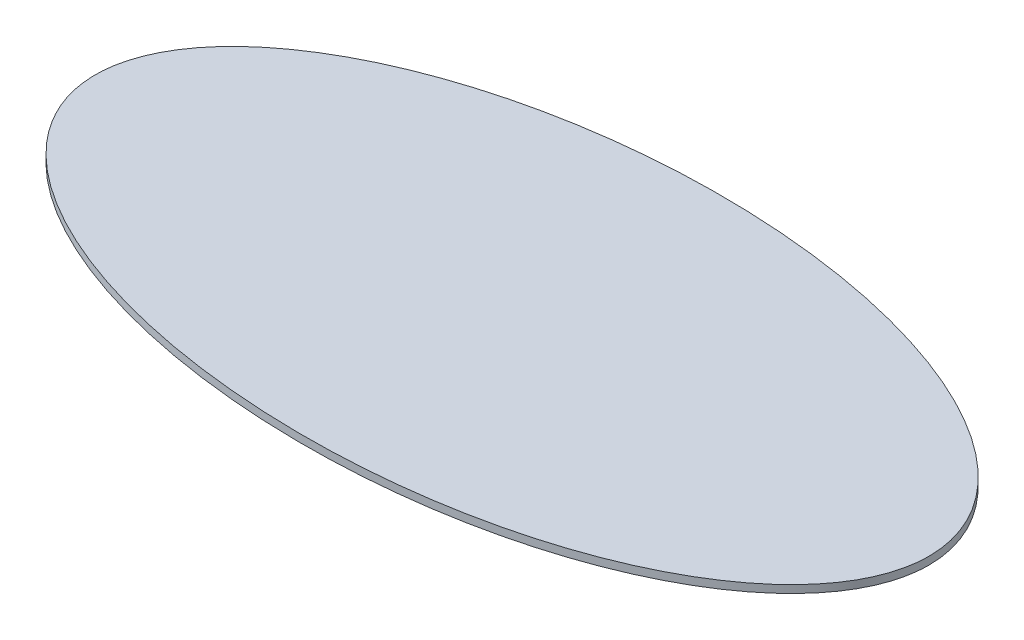
ISO-10303-21;
HEADER;
FILE_DESCRIPTION(('STEP AP214'),'2;1');
FILE_NAME('part.step','',(''),(''),'','','');
FILE_SCHEMA(('AUTOMOTIVE_DESIGN { 1 0 10303 214 1 1 1 1 }'));
ENDSEC;
DATA;
#1=APPLICATION_CONTEXT('core data for automotive mechanical design processes');
#2=APPLICATION_PROTOCOL_DEFINITION('international standard','automotive_design',2000,#1);
#3=PRODUCT_CONTEXT('',#1,'mechanical');
#4=PRODUCT('Part','Part','',(#3));
#5=PRODUCT_RELATED_PRODUCT_CATEGORY('part','',(#4));
#6=PRODUCT_DEFINITION_FORMATION('','',#4);
#7=PRODUCT_DEFINITION_CONTEXT('part definition',#1,'design');
#8=PRODUCT_DEFINITION('design','',#6,#7);
#9=PRODUCT_DEFINITION_SHAPE('','',#8);
#10=(LENGTH_UNIT() NAMED_UNIT(*) SI_UNIT(.MILLI.,.METRE.));
#11=(NAMED_UNIT(*) PLANE_ANGLE_UNIT() SI_UNIT($,.RADIAN.));
#12=(NAMED_UNIT(*) SI_UNIT($,.STERADIAN.) SOLID_ANGLE_UNIT());
#13=UNCERTAINTY_MEASURE_WITH_UNIT(LENGTH_MEASURE(1.E-05),#10,'distance_accuracy_value','');
#14=(GEOMETRIC_REPRESENTATION_CONTEXT(3) GLOBAL_UNCERTAINTY_ASSIGNED_CONTEXT((#13)) GLOBAL_UNIT_ASSIGNED_CONTEXT((#10,
#11,#12)) REPRESENTATION_CONTEXT('',''));
#15=CARTESIAN_POINT('',(0.,0.,0.));
#16=DIRECTION('',(0.,0.,1.));
#17=DIRECTION('',(1.,0.,0.));
#18=AXIS2_PLACEMENT_3D('',#15,#16,#17);
#19=CARTESIAN_POINT('',(0.,1.,0.));
#20=DIRECTION('',(0.,1.,0.));
#21=DIRECTION('',(1.,0.,0.));
#22=AXIS2_PLACEMENT_3D('',#19,#20,#21);
#23=ELLIPSE('',#22,54.,27.);
#24=DIRECTION('',(0.,-1.,0.));
#25=VECTOR('',#24,1.);
#26=SURFACE_OF_LINEAR_EXTRUSION('',#23,#25);
#27=CARTESIAN_POINT('',(54.,1.,0.));
#28=VERTEX_POINT('',#27);
#29=EDGE_CURVE('E10',#28,#28,#23,.T.);
#30=ORIENTED_EDGE('',*,*,#29,.F.);
#31=EDGE_LOOP('',(#30));
#32=FACE_BOUND('',#31,.T.);
#33=CARTESIAN_POINT('',(0.,0.,0.));
#34=DIRECTION('',(0.,1.,0.));
#35=DIRECTION('',(1.,0.,0.));
#36=AXIS2_PLACEMENT_3D('',#33,#34,#35);
#37=ELLIPSE('',#36,54.,27.);
#38=CARTESIAN_POINT('',(54.,0.,0.));
#39=VERTEX_POINT('',#38);
#40=EDGE_CURVE('E38',#39,#39,#37,.T.);
#41=ORIENTED_EDGE('',*,*,#40,.T.);
#42=EDGE_LOOP('',(#41));
#43=FACE_BOUND('',#42,.T.);
#44=ADVANCED_FACE('F34',(#32,#43),#26,.F.);
#45=CARTESIAN_POINT('',(0.,1.,0.));
#46=DIRECTION('',(0.,1.,0.));
#47=DIRECTION('',(0.,0.,1.));
#48=AXIS2_PLACEMENT_3D('',#45,#46,#47);
#49=PLANE('',#48);
#50=ORIENTED_EDGE('',*,*,#29,.T.);
#51=EDGE_LOOP('',(#50));
#52=FACE_BOUND('',#51,.T.);
#53=ADVANCED_FACE('F50',(#52),#49,.T.);
#54=CARTESIAN_POINT('',(0.,0.,0.));
#55=DIRECTION('',(0.,1.,0.));
#56=DIRECTION('',(0.,0.,1.));
#57=AXIS2_PLACEMENT_3D('',#54,#55,#56);
#58=PLANE('',#57);
#59=ORIENTED_EDGE('',*,*,#40,.F.);
#60=EDGE_LOOP('',(#59));
#61=FACE_BOUND('',#60,.T.);
#62=ADVANCED_FACE('F48',(#61),#58,.F.);
#63=CLOSED_SHELL('',(#44,#53,#62));
#64=MANIFOLD_SOLID_BREP('B2',#63);
#65=ADVANCED_BREP_SHAPE_REPRESENTATION('',(#18,#64),#14);
#66=SHAPE_DEFINITION_REPRESENTATION(#9,#65);
ENDSEC;
END-ISO-10303-21;
